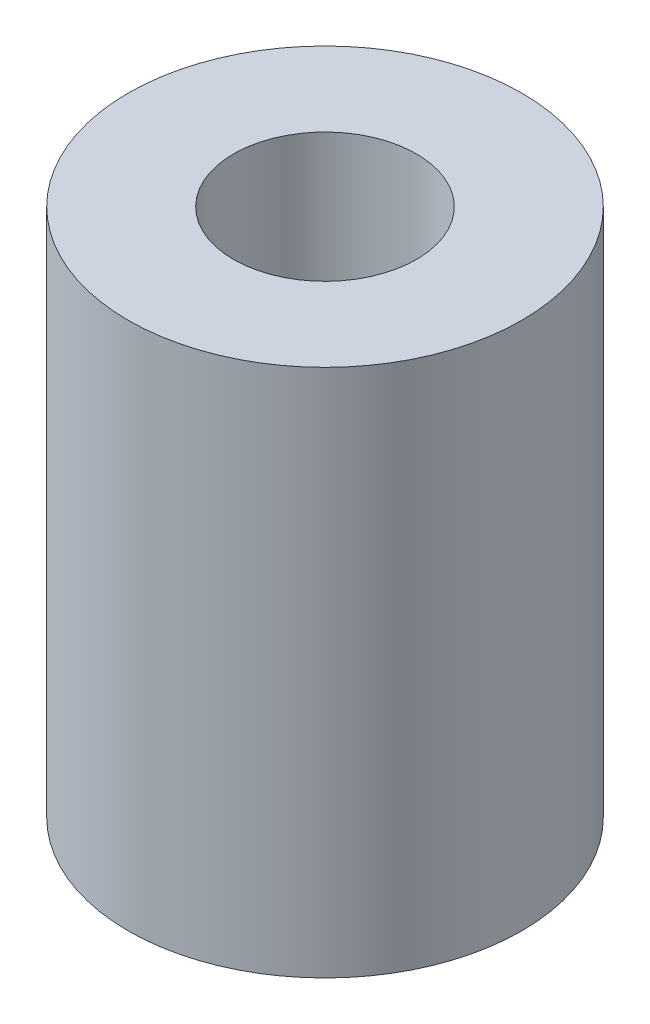
ISO-10303-21;
HEADER;
FILE_DESCRIPTION(('STEP AP214'),'2;1');
FILE_NAME('part.step','',(''),(''),'','','');
FILE_SCHEMA(('AUTOMOTIVE_DESIGN { 1 0 10303 214 1 1 1 1 }'));
ENDSEC;
DATA;
#1=APPLICATION_CONTEXT('core data for automotive mechanical design processes');
#2=APPLICATION_PROTOCOL_DEFINITION('international standard','automotive_design',2000,#1);
#3=PRODUCT_CONTEXT('',#1,'mechanical');
#4=PRODUCT('Part','Part','',(#3));
#5=PRODUCT_RELATED_PRODUCT_CATEGORY('part','',(#4));
#6=PRODUCT_DEFINITION_FORMATION('','',#4);
#7=PRODUCT_DEFINITION_CONTEXT('part definition',#1,'design');
#8=PRODUCT_DEFINITION('design','',#6,#7);
#9=PRODUCT_DEFINITION_SHAPE('','',#8);
#10=(LENGTH_UNIT() NAMED_UNIT(*) SI_UNIT(.MILLI.,.METRE.));
#11=(NAMED_UNIT(*) PLANE_ANGLE_UNIT() SI_UNIT($,.RADIAN.));
#12=(NAMED_UNIT(*) SI_UNIT($,.STERADIAN.) SOLID_ANGLE_UNIT());
#13=UNCERTAINTY_MEASURE_WITH_UNIT(LENGTH_MEASURE(1.E-05),#10,'distance_accuracy_value','');
#14=(GEOMETRIC_REPRESENTATION_CONTEXT(3) GLOBAL_UNCERTAINTY_ASSIGNED_CONTEXT((#13)) GLOBAL_UNIT_ASSIGNED_CONTEXT((#10,
#11,#12)) REPRESENTATION_CONTEXT('',''));
#15=CARTESIAN_POINT('',(0.,0.,0.));
#16=DIRECTION('',(0.,0.,1.));
#17=DIRECTION('',(1.,0.,0.));
#18=AXIS2_PLACEMENT_3D('',#15,#16,#17);
#19=CARTESIAN_POINT('',(0.,6.35,0.));
#20=DIRECTION('',(0.,1.,0.));
#21=DIRECTION('',(0.,0.,1.));
#22=AXIS2_PLACEMENT_3D('',#19,#20,#21);
#23=PLANE('',#22);
#24=CARTESIAN_POINT('',(0.,6.35,0.));
#25=DIRECTION('',(0.,1.,0.));
#26=DIRECTION('',(0.,0.,1.));
#27=AXIS2_PLACEMENT_3D('',#24,#25,#26);
#28=CIRCLE('',#27,2.363);
#29=CARTESIAN_POINT('',(0.,6.35,2.363));
#30=VERTEX_POINT('',#29);
#31=EDGE_CURVE('E10',#30,#30,#28,.T.);
#32=ORIENTED_EDGE('',*,*,#31,.T.);
#33=EDGE_LOOP('',(#32));
#34=FACE_BOUND('',#33,.T.);
#35=CARTESIAN_POINT('',(0.,6.35,0.));
#36=DIRECTION('',(0.,1.,0.));
#37=DIRECTION('',(0.,0.,1.));
#38=AXIS2_PLACEMENT_3D('',#35,#36,#37);
#39=CIRCLE('',#38,1.098320384);
#40=CARTESIAN_POINT('',(0.,6.35,1.098320384));
#41=VERTEX_POINT('',#40);
#42=EDGE_CURVE('E56',#41,#41,#39,.T.);
#43=ORIENTED_EDGE('',*,*,#42,.F.);
#44=EDGE_LOOP('',(#43));
#45=FACE_BOUND('',#44,.T.);
#46=ADVANCED_FACE('F43',(#34,#45),#23,.T.);
#47=CARTESIAN_POINT('',(0.,0.,0.));
#48=DIRECTION('',(0.,1.,0.));
#49=DIRECTION('',(0.,0.,1.));
#50=AXIS2_PLACEMENT_3D('',#47,#48,#49);
#51=PLANE('',#50);
#52=CARTESIAN_POINT('',(0.,0.,0.));
#53=DIRECTION('',(0.,1.,0.));
#54=DIRECTION('',(0.,0.,1.));
#55=AXIS2_PLACEMENT_3D('',#52,#53,#54);
#56=CIRCLE('',#55,2.363);
#57=CARTESIAN_POINT('',(0.,0.,2.363));
#58=VERTEX_POINT('',#57);
#59=EDGE_CURVE('E47',#58,#58,#56,.T.);
#60=ORIENTED_EDGE('',*,*,#59,.F.);
#61=EDGE_LOOP('',(#60));
#62=FACE_BOUND('',#61,.T.);
#63=CARTESIAN_POINT('',(0.,0.,0.));
#64=DIRECTION('',(0.,1.,0.));
#65=DIRECTION('',(0.,0.,1.));
#66=AXIS2_PLACEMENT_3D('',#63,#64,#65);
#67=CIRCLE('',#66,1.098320384);
#68=CARTESIAN_POINT('',(0.,0.,1.098320384));
#69=VERTEX_POINT('',#68);
#70=EDGE_CURVE('E58',#69,#69,#67,.T.);
#71=ORIENTED_EDGE('',*,*,#70,.T.);
#72=EDGE_LOOP('',(#71));
#73=FACE_BOUND('',#72,.T.);
#74=ADVANCED_FACE('F70',(#62,#73),#51,.F.);
#75=CARTESIAN_POINT('',(0.,6.35,0.));
#76=DIRECTION('',(0.,-1.,0.));
#77=DIRECTION('',(0.,0.,-1.));
#78=AXIS2_PLACEMENT_3D('',#75,#76,#77);
#79=CYLINDRICAL_SURFACE('',#78,2.363);
#80=ORIENTED_EDGE('',*,*,#31,.F.);
#81=EDGE_LOOP('',(#80));
#82=FACE_BOUND('',#81,.T.);
#83=ORIENTED_EDGE('',*,*,#59,.T.);
#84=EDGE_LOOP('',(#83));
#85=FACE_BOUND('',#84,.T.);
#86=ADVANCED_FACE('F45',(#82,#85),#79,.T.);
#87=CARTESIAN_POINT('',(0.,6.35,0.));
#88=DIRECTION('',(0.,-1.,0.));
#89=DIRECTION('',(0.,0.,-1.));
#90=AXIS2_PLACEMENT_3D('',#87,#88,#89);
#91=CYLINDRICAL_SURFACE('',#90,1.098320384);
#92=ORIENTED_EDGE('',*,*,#42,.T.);
#93=EDGE_LOOP('',(#92));
#94=FACE_BOUND('',#93,.T.);
#95=ORIENTED_EDGE('',*,*,#70,.F.);
#96=EDGE_LOOP('',(#95));
#97=FACE_BOUND('',#96,.T.);
#98=ADVANCED_FACE('F66',(#94,#97),#91,.F.);
#99=CLOSED_SHELL('',(#46,#74,#86,#98));
#100=MANIFOLD_SOLID_BREP('B2',#99);
#101=ADVANCED_BREP_SHAPE_REPRESENTATION('',(#18,#100),#14);
#102=SHAPE_DEFINITION_REPRESENTATION(#9,#101);
ENDSEC;
END-ISO-10303-21;
